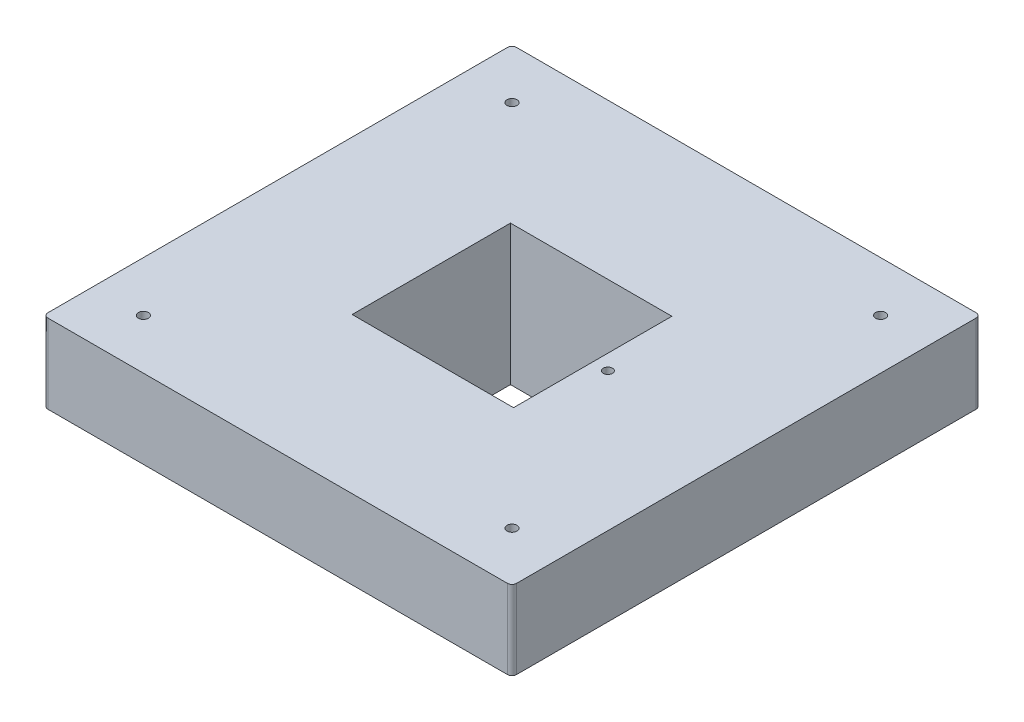
ISO-10303-21;
HEADER;
FILE_DESCRIPTION(('STEP AP214'),'2;1');
FILE_NAME('part.step','',(''),(''),'','','');
FILE_SCHEMA(('AUTOMOTIVE_DESIGN { 1 0 10303 214 1 1 1 1 }'));
ENDSEC;
DATA;
#1=APPLICATION_CONTEXT('core data for automotive mechanical design processes');
#2=APPLICATION_PROTOCOL_DEFINITION('international standard','automotive_design',2000,#1);
#3=PRODUCT_CONTEXT('',#1,'mechanical');
#4=PRODUCT('Part','Part','',(#3));
#5=PRODUCT_RELATED_PRODUCT_CATEGORY('part','',(#4));
#6=PRODUCT_DEFINITION_FORMATION('','',#4);
#7=PRODUCT_DEFINITION_CONTEXT('part definition',#1,'design');
#8=PRODUCT_DEFINITION('design','',#6,#7);
#9=PRODUCT_DEFINITION_SHAPE('','',#8);
#10=(LENGTH_UNIT() NAMED_UNIT(*) SI_UNIT(.MILLI.,.METRE.));
#11=(NAMED_UNIT(*) PLANE_ANGLE_UNIT() SI_UNIT($,.RADIAN.));
#12=(NAMED_UNIT(*) SI_UNIT($,.STERADIAN.) SOLID_ANGLE_UNIT());
#13=UNCERTAINTY_MEASURE_WITH_UNIT(LENGTH_MEASURE(1.E-05),#10,'distance_accuracy_value','');
#14=(GEOMETRIC_REPRESENTATION_CONTEXT(3) GLOBAL_UNCERTAINTY_ASSIGNED_CONTEXT((#13)) GLOBAL_UNIT_ASSIGNED_CONTEXT((#10,
#11,#12)) REPRESENTATION_CONTEXT('',''));
#15=CARTESIAN_POINT('',(0.,0.,0.));
#16=DIRECTION('',(0.,0.,1.));
#17=DIRECTION('',(1.,0.,0.));
#18=AXIS2_PLACEMENT_3D('',#15,#16,#17);
#19=CARTESIAN_POINT('',(0.,-25.95,0.));
#20=DIRECTION('',(0.,1.,0.));
#21=DIRECTION('',(0.,0.,1.));
#22=AXIS2_PLACEMENT_3D('',#19,#20,#21);
#23=PLANE('',#22);
#24=DIRECTION('',(0.,0.,-1.));
#25=VECTOR('',#24,1.);
#26=CARTESIAN_POINT('',(-76.96,-25.95,0.));
#27=LINE('',#26,#25);
#28=CARTESIAN_POINT('',(-76.96,-25.95,75.46));
#29=VERTEX_POINT('',#28);
#30=CARTESIAN_POINT('',(-76.96,-25.95,-75.46));
#31=VERTEX_POINT('',#30);
#32=EDGE_CURVE('E195',#29,#31,#27,.T.);
#33=ORIENTED_EDGE('',*,*,#32,.T.);
#34=CARTESIAN_POINT('',(-75.46,-25.95,-75.46));
#35=DIRECTION('',(0.,1.,0.));
#36=DIRECTION('',(0.,0.,1.));
#37=AXIS2_PLACEMENT_3D('',#34,#35,#36);
#38=CIRCLE('',#37,1.5);
#39=CARTESIAN_POINT('',(-75.46,-25.95,-76.96));
#40=VERTEX_POINT('',#39);
#41=EDGE_CURVE('E250',#31,#40,#38,.F.);
#42=ORIENTED_EDGE('',*,*,#41,.T.);
#43=DIRECTION('',(1.,0.,0.));
#44=VECTOR('',#43,1.);
#45=CARTESIAN_POINT('',(0.,-25.95,-76.96));
#46=LINE('',#45,#44);
#47=CARTESIAN_POINT('',(75.46,-25.95,-76.96));
#48=VERTEX_POINT('',#47);
#49=EDGE_CURVE('E193',#40,#48,#46,.T.);
#50=ORIENTED_EDGE('',*,*,#49,.T.);
#51=CARTESIAN_POINT('',(75.46,-25.95,-75.46));
#52=DIRECTION('',(0.,1.,0.));
#53=DIRECTION('',(0.,0.,1.));
#54=AXIS2_PLACEMENT_3D('',#51,#52,#53);
#55=CIRCLE('',#54,1.5);
#56=CARTESIAN_POINT('',(76.96,-25.95,-75.46));
#57=VERTEX_POINT('',#56);
#58=EDGE_CURVE('E49',#48,#57,#55,.F.);
#59=ORIENTED_EDGE('',*,*,#58,.T.);
#60=DIRECTION('',(0.,0.,-1.));
#61=VECTOR('',#60,1.);
#62=CARTESIAN_POINT('',(76.96,-25.95,0.));
#63=LINE('',#62,#61);
#64=CARTESIAN_POINT('',(76.96,-25.95,75.46));
#65=VERTEX_POINT('',#64);
#66=EDGE_CURVE('E191',#65,#57,#63,.T.);
#67=ORIENTED_EDGE('',*,*,#66,.F.);
#68=CARTESIAN_POINT('',(75.46,-25.95,75.46));
#69=DIRECTION('',(0.,1.,0.));
#70=DIRECTION('',(0.,0.,1.));
#71=AXIS2_PLACEMENT_3D('',#68,#69,#70);
#72=CIRCLE('',#71,1.5);
#73=CARTESIAN_POINT('',(75.46,-25.95,76.96));
#74=VERTEX_POINT('',#73);
#75=EDGE_CURVE('E245',#65,#74,#72,.F.);
#76=ORIENTED_EDGE('',*,*,#75,.T.);
#77=DIRECTION('',(1.,0.,0.));
#78=VECTOR('',#77,1.);
#79=CARTESIAN_POINT('',(0.,-25.95,76.96));
#80=LINE('',#79,#78);
#81=CARTESIAN_POINT('',(-75.46,-25.95,76.96));
#82=VERTEX_POINT('',#81);
#83=EDGE_CURVE('E187',#82,#74,#80,.T.);
#84=ORIENTED_EDGE('',*,*,#83,.F.);
#85=CARTESIAN_POINT('',(-75.46,-25.95,75.46));
#86=DIRECTION('',(0.,1.,0.));
#87=DIRECTION('',(0.,0.,1.));
#88=AXIS2_PLACEMENT_3D('',#85,#86,#87);
#89=CIRCLE('',#88,1.5);
#90=EDGE_CURVE('E247',#82,#29,#89,.F.);
#91=ORIENTED_EDGE('',*,*,#90,.T.);
#92=EDGE_LOOP('',(#33,#42,#50,#59,#67,#76,#84,#91));
#93=FACE_BOUND('',#92,.T.);
#94=CARTESIAN_POINT('',(60.5282,-25.95,-60.5282));
#95=DIRECTION('',(0.,1.,0.));
#96=DIRECTION('',(0.,0.,1.));
#97=AXIS2_PLACEMENT_3D('',#94,#95,#96);
#98=CIRCLE('',#97,1.64999999999998);
#99=CARTESIAN_POINT('',(60.5282,-25.95,-58.8782));
#100=VERTEX_POINT('',#99);
#101=EDGE_CURVE('E180',#100,#100,#98,.T.);
#102=ORIENTED_EDGE('',*,*,#101,.T.);
#103=EDGE_LOOP('',(#102));
#104=FACE_BOUND('',#103,.T.);
#105=CARTESIAN_POINT('',(60.5282,-25.95,60.5282));
#106=DIRECTION('',(0.,1.,0.));
#107=DIRECTION('',(0.,0.,1.));
#108=AXIS2_PLACEMENT_3D('',#105,#106,#107);
#109=CIRCLE('',#108,1.64999999999998);
#110=CARTESIAN_POINT('',(60.5282,-25.95,62.1782));
#111=VERTEX_POINT('',#110);
#112=EDGE_CURVE('E174',#111,#111,#109,.T.);
#113=ORIENTED_EDGE('',*,*,#112,.T.);
#114=EDGE_LOOP('',(#113));
#115=FACE_BOUND('',#114,.T.);
#116=CARTESIAN_POINT('',(-60.5282,-25.95,60.5282));
#117=DIRECTION('',(0.,1.,0.));
#118=DIRECTION('',(0.,0.,1.));
#119=AXIS2_PLACEMENT_3D('',#116,#117,#118);
#120=CIRCLE('',#119,1.64999999999998);
#121=CARTESIAN_POINT('',(-60.5282,-25.95,62.1782));
#122=VERTEX_POINT('',#121);
#123=EDGE_CURVE('E168',#122,#122,#120,.T.);
#124=ORIENTED_EDGE('',*,*,#123,.T.);
#125=EDGE_LOOP('',(#124));
#126=FACE_BOUND('',#125,.T.);
#127=CARTESIAN_POINT('',(-60.5282,-25.95,-60.5282));
#128=DIRECTION('',(0.,1.,0.));
#129=DIRECTION('',(0.,0.,1.));
#130=AXIS2_PLACEMENT_3D('',#127,#128,#129);
#131=CIRCLE('',#130,1.64999999999998);
#132=CARTESIAN_POINT('',(-60.5282,-25.95,-58.8782));
#133=VERTEX_POINT('',#132);
#134=EDGE_CURVE('E162',#133,#133,#131,.T.);
#135=ORIENTED_EDGE('',*,*,#134,.T.);
#136=EDGE_LOOP('',(#135));
#137=FACE_BOUND('',#136,.T.);
#138=CARTESIAN_POINT('',(0.,-25.95,0.));
#139=DIRECTION('',(0.,1.,0.));
#140=DIRECTION('',(0.,0.,1.));
#141=AXIS2_PLACEMENT_3D('',#138,#139,#140);
#142=CIRCLE('',#141,55.);
#143=CARTESIAN_POINT('',(0.,-25.95,55.));
#144=VERTEX_POINT('',#143);
#145=EDGE_CURVE('E135',#144,#144,#142,.F.);
#146=ORIENTED_EDGE('',*,*,#145,.F.);
#147=EDGE_LOOP('',(#146));
#148=FACE_BOUND('',#147,.T.);
#149=ADVANCED_FACE('F34',(#93,#104,#115,#126,#137,#148),#23,.F.);
#150=CARTESIAN_POINT('',(0.,-25.95,76.96));
#151=DIRECTION('',(0.,0.,1.));
#152=DIRECTION('',(1.,0.,0.));
#153=AXIS2_PLACEMENT_3D('',#150,#151,#152);
#154=PLANE('',#153);
#155=DIRECTION('',(1.,0.,0.));
#156=VECTOR('',#155,1.);
#157=CARTESIAN_POINT('',(0.,0.,76.96));
#158=LINE('',#157,#156);
#159=CARTESIAN_POINT('',(-75.46,0.,76.96));
#160=VERTEX_POINT('',#159);
#161=CARTESIAN_POINT('',(75.46,0.,76.96));
#162=VERTEX_POINT('',#161);
#163=EDGE_CURVE('E210',#160,#162,#158,.T.);
#164=ORIENTED_EDGE('',*,*,#163,.F.);
#165=DIRECTION('',(0.,1.,0.));
#166=VECTOR('',#165,1.);
#167=CARTESIAN_POINT('',(-75.46,-25.95,76.96));
#168=LINE('',#167,#166);
#169=EDGE_CURVE('E11',#160,#82,#168,.F.);
#170=ORIENTED_EDGE('',*,*,#169,.T.);
#171=ORIENTED_EDGE('',*,*,#83,.T.);
#172=DIRECTION('',(0.,1.,0.));
#173=VECTOR('',#172,1.);
#174=CARTESIAN_POINT('',(75.46,-25.95,76.96));
#175=LINE('',#174,#173);
#176=EDGE_CURVE('E42',#74,#162,#175,.T.);
#177=ORIENTED_EDGE('',*,*,#176,.T.);
#178=EDGE_LOOP('',(#164,#170,#171,#177));
#179=FACE_BOUND('',#178,.T.);
#180=ADVANCED_FACE('F259',(#179),#154,.T.);
#181=CARTESIAN_POINT('',(-76.96,-25.95,0.));
#182=DIRECTION('',(1.,0.,0.));
#183=DIRECTION('',(0.,0.,-1.));
#184=AXIS2_PLACEMENT_3D('',#181,#182,#183);
#185=PLANE('',#184);
#186=DIRECTION('',(0.,0.,-1.));
#187=VECTOR('',#186,1.);
#188=CARTESIAN_POINT('',(-76.96,0.,0.));
#189=LINE('',#188,#187);
#190=CARTESIAN_POINT('',(-76.96,0.,75.46));
#191=VERTEX_POINT('',#190);
#192=CARTESIAN_POINT('',(-76.96,0.,-75.46));
#193=VERTEX_POINT('',#192);
#194=EDGE_CURVE('E188',#191,#193,#189,.T.);
#195=ORIENTED_EDGE('',*,*,#194,.T.);
#196=DIRECTION('',(0.,1.,0.));
#197=VECTOR('',#196,1.);
#198=CARTESIAN_POINT('',(-76.96,-25.95,-75.46));
#199=LINE('',#198,#197);
#200=EDGE_CURVE('E243',#193,#31,#199,.F.);
#201=ORIENTED_EDGE('',*,*,#200,.T.);
#202=ORIENTED_EDGE('',*,*,#32,.F.);
#203=DIRECTION('',(0.,1.,0.));
#204=VECTOR('',#203,1.);
#205=CARTESIAN_POINT('',(-76.96,0.,75.46));
#206=LINE('',#205,#204);
#207=EDGE_CURVE('E240',#29,#191,#206,.T.);
#208=ORIENTED_EDGE('',*,*,#207,.T.);
#209=EDGE_LOOP('',(#195,#201,#202,#208));
#210=FACE_BOUND('',#209,.T.);
#211=ADVANCED_FACE('F274',(#210),#185,.F.);
#212=CARTESIAN_POINT('',(0.,-25.95,-76.96));
#213=DIRECTION('',(0.,0.,1.));
#214=DIRECTION('',(1.,0.,0.));
#215=AXIS2_PLACEMENT_3D('',#212,#213,#214);
#216=PLANE('',#215);
#217=ORIENTED_EDGE('',*,*,#49,.F.);
#218=DIRECTION('',(0.,1.,0.));
#219=VECTOR('',#218,1.);
#220=CARTESIAN_POINT('',(-75.46,-25.95,-76.96));
#221=LINE('',#220,#219);
#222=CARTESIAN_POINT('',(-75.46,0.,-76.96));
#223=VERTEX_POINT('',#222);
#224=EDGE_CURVE('E229',#40,#223,#221,.T.);
#225=ORIENTED_EDGE('',*,*,#224,.T.);
#226=DIRECTION('',(1.,0.,0.));
#227=VECTOR('',#226,1.);
#228=CARTESIAN_POINT('',(0.,0.,-76.96));
#229=LINE('',#228,#227);
#230=CARTESIAN_POINT('',(75.46,0.,-76.96));
#231=VERTEX_POINT('',#230);
#232=EDGE_CURVE('E216',#223,#231,#229,.T.);
#233=ORIENTED_EDGE('',*,*,#232,.T.);
#234=DIRECTION('',(0.,1.,0.));
#235=VECTOR('',#234,1.);
#236=CARTESIAN_POINT('',(75.46,-25.95,-76.96));
#237=LINE('',#236,#235);
#238=EDGE_CURVE('E227',#231,#48,#237,.F.);
#239=ORIENTED_EDGE('',*,*,#238,.T.);
#240=EDGE_LOOP('',(#217,#225,#233,#239));
#241=FACE_BOUND('',#240,.T.);
#242=ADVANCED_FACE('F283',(#241),#216,.F.);
#243=CARTESIAN_POINT('',(0.,-25.95,-26.));
#244=DIRECTION('',(0.,0.,1.));
#245=DIRECTION('',(1.,0.,0.));
#246=AXIS2_PLACEMENT_3D('',#243,#244,#245);
#247=PLANE('',#246);
#248=DIRECTION('',(1.,0.,0.));
#249=VECTOR('',#248,1.);
#250=CARTESIAN_POINT('',(0.,0.,-26.));
#251=LINE('',#250,#249);
#252=CARTESIAN_POINT('',(-26.5,0.,-26.));
#253=VERTEX_POINT('',#252);
#254=CARTESIAN_POINT('',(26.5,0.,-26.));
#255=VERTEX_POINT('',#254);
#256=EDGE_CURVE('E131',#253,#255,#251,.T.);
#257=ORIENTED_EDGE('',*,*,#256,.F.);
#258=DIRECTION('',(0.,1.,0.));
#259=VECTOR('',#258,1.);
#260=CARTESIAN_POINT('',(-26.5,-25.95,-26.));
#261=LINE('',#260,#259);
#262=CARTESIAN_POINT('',(-26.5,-45.95,-26.));
#263=VERTEX_POINT('',#262);
#264=EDGE_CURVE('E124',#263,#253,#261,.T.);
#265=ORIENTED_EDGE('',*,*,#264,.F.);
#266=DIRECTION('',(1.,0.,0.));
#267=VECTOR('',#266,1.);
#268=CARTESIAN_POINT('',(-26.5,-45.95,-26.));
#269=LINE('',#268,#267);
#270=CARTESIAN_POINT('',(26.5,-45.95,-26.));
#271=VERTEX_POINT('',#270);
#272=EDGE_CURVE('E128',#263,#271,#269,.T.);
#273=ORIENTED_EDGE('',*,*,#272,.T.);
#274=DIRECTION('',(0.,1.,0.));
#275=VECTOR('',#274,1.);
#276=CARTESIAN_POINT('',(26.5,-25.95,-26.));
#277=LINE('',#276,#275);
#278=EDGE_CURVE('E198',#271,#255,#277,.T.);
#279=ORIENTED_EDGE('',*,*,#278,.T.);
#280=EDGE_LOOP('',(#257,#265,#273,#279));
#281=FACE_BOUND('',#280,.T.);
#282=ADVANCED_FACE('F126',(#281),#247,.T.);
#283=CARTESIAN_POINT('',(-26.5,-25.95,0.));
#284=DIRECTION('',(-1.,0.,0.));
#285=DIRECTION('',(0.,0.,1.));
#286=AXIS2_PLACEMENT_3D('',#283,#284,#285);
#287=PLANE('',#286);
#288=DIRECTION('',(0.,0.,1.));
#289=VECTOR('',#288,1.);
#290=CARTESIAN_POINT('',(-26.5,0.,0.));
#291=LINE('',#290,#289);
#292=CARTESIAN_POINT('',(-26.5,0.,26.));
#293=VERTEX_POINT('',#292);
#294=EDGE_CURVE('E208',#253,#293,#291,.T.);
#295=ORIENTED_EDGE('',*,*,#294,.T.);
#296=DIRECTION('',(0.,1.,0.));
#297=VECTOR('',#296,1.);
#298=CARTESIAN_POINT('',(-26.5,-25.95,26.));
#299=LINE('',#298,#297);
#300=CARTESIAN_POINT('',(-26.5,-45.95,26.));
#301=VERTEX_POINT('',#300);
#302=EDGE_CURVE('E136',#301,#293,#299,.T.);
#303=ORIENTED_EDGE('',*,*,#302,.F.);
#304=DIRECTION('',(0.,0.,-1.));
#305=VECTOR('',#304,1.);
#306=CARTESIAN_POINT('',(-26.5,-45.95,26.));
#307=LINE('',#306,#305);
#308=EDGE_CURVE('E139',#301,#263,#307,.T.);
#309=ORIENTED_EDGE('',*,*,#308,.T.);
#310=ORIENTED_EDGE('',*,*,#264,.T.);
#311=EDGE_LOOP('',(#295,#303,#309,#310));
#312=FACE_BOUND('',#311,.T.);
#313=ADVANCED_FACE('F140',(#312),#287,.F.);
#314=CARTESIAN_POINT('',(0.,-25.95,26.));
#315=DIRECTION('',(0.,0.,1.));
#316=DIRECTION('',(1.,0.,0.));
#317=AXIS2_PLACEMENT_3D('',#314,#315,#316);
#318=PLANE('',#317);
#319=DIRECTION('',(1.,0.,0.));
#320=VECTOR('',#319,1.);
#321=CARTESIAN_POINT('',(0.,0.,26.));
#322=LINE('',#321,#320);
#323=CARTESIAN_POINT('',(26.5,0.,26.));
#324=VERTEX_POINT('',#323);
#325=EDGE_CURVE('E205',#293,#324,#322,.T.);
#326=ORIENTED_EDGE('',*,*,#325,.T.);
#327=DIRECTION('',(0.,1.,0.));
#328=VECTOR('',#327,1.);
#329=CARTESIAN_POINT('',(26.5,-25.95,26.));
#330=LINE('',#329,#328);
#331=CARTESIAN_POINT('',(26.5,-45.95,26.));
#332=VERTEX_POINT('',#331);
#333=EDGE_CURVE('E222',#332,#324,#330,.T.);
#334=ORIENTED_EDGE('',*,*,#333,.F.);
#335=DIRECTION('',(-1.,0.,0.));
#336=VECTOR('',#335,1.);
#337=CARTESIAN_POINT('',(-26.5,-45.95,26.));
#338=LINE('',#337,#336);
#339=EDGE_CURVE('E151',#332,#301,#338,.T.);
#340=ORIENTED_EDGE('',*,*,#339,.T.);
#341=ORIENTED_EDGE('',*,*,#302,.T.);
#342=EDGE_LOOP('',(#326,#334,#340,#341));
#343=FACE_BOUND('',#342,.T.);
#344=ADVANCED_FACE('F315',(#343),#318,.F.);
#345=CARTESIAN_POINT('',(26.5,-25.95,0.));
#346=DIRECTION('',(-1.,0.,0.));
#347=DIRECTION('',(0.,0.,1.));
#348=AXIS2_PLACEMENT_3D('',#345,#346,#347);
#349=PLANE('',#348);
#350=DIRECTION('',(0.,0.,1.));
#351=VECTOR('',#350,1.);
#352=CARTESIAN_POINT('',(26.5,0.,0.));
#353=LINE('',#352,#351);
#354=EDGE_CURVE('E202',#255,#324,#353,.T.);
#355=ORIENTED_EDGE('',*,*,#354,.F.);
#356=ORIENTED_EDGE('',*,*,#278,.F.);
#357=DIRECTION('',(0.,0.,1.));
#358=VECTOR('',#357,1.);
#359=CARTESIAN_POINT('',(26.5,-45.95,26.));
#360=LINE('',#359,#358);
#361=EDGE_CURVE('E149',#271,#332,#360,.T.);
#362=ORIENTED_EDGE('',*,*,#361,.T.);
#363=ORIENTED_EDGE('',*,*,#333,.T.);
#364=EDGE_LOOP('',(#355,#356,#362,#363));
#365=FACE_BOUND('',#364,.T.);
#366=ADVANCED_FACE('F318',(#365),#349,.T.);
#367=CARTESIAN_POINT('',(31.5,-25.95,0.));
#368=DIRECTION('',(0.,1.,0.));
#369=DIRECTION('',(0.,0.,1.));
#370=AXIS2_PLACEMENT_3D('',#367,#368,#369);
#371=CYLINDRICAL_SURFACE('',#370,1.5);
#372=CARTESIAN_POINT('',(31.5,-25.95,0.));
#373=DIRECTION('',(0.,1.,0.));
#374=DIRECTION('',(0.,0.,1.));
#375=AXIS2_PLACEMENT_3D('',#372,#373,#374);
#376=CIRCLE('',#375,1.5);
#377=CARTESIAN_POINT('',(31.5,-25.95,1.5));
#378=VERTEX_POINT('',#377);
#379=EDGE_CURVE('E184',#378,#378,#376,.T.);
#380=CARTESIAN_POINT('',(31.5,0.,0.));
#381=DIRECTION('',(0.,1.,0.));
#382=DIRECTION('',(0.,0.,1.));
#383=AXIS2_PLACEMENT_3D('',#380,#381,#382);
#384=CIRCLE('',#383,1.5);
#385=CARTESIAN_POINT('',(31.5,0.,1.5));
#386=VERTEX_POINT('',#385);
#387=EDGE_CURVE('E183',#386,#386,#384,.T.);
#388=CARTESIAN_POINT('',(31.5,-25.95,1.5));
#389=CARTESIAN_POINT('',(31.5,-25.6796875,1.5));
#390=CARTESIAN_POINT('',(31.5,-25.409375,1.5));
#391=CARTESIAN_POINT('',(31.5,-24.86875,1.5));
#392=CARTESIAN_POINT('',(31.5,-24.5984375,1.5));
#393=CARTESIAN_POINT('',(31.5,-24.0578125,1.5));
#394=CARTESIAN_POINT('',(31.5,-23.7875,1.5));
#395=CARTESIAN_POINT('',(31.5,-23.246875,1.5));
#396=CARTESIAN_POINT('',(31.5,-22.9765625,1.5));
#397=CARTESIAN_POINT('',(31.5,-22.4359375,1.5));
#398=CARTESIAN_POINT('',(31.5,-22.165625,1.5));
#399=CARTESIAN_POINT('',(31.5,-21.625,1.5));
#400=CARTESIAN_POINT('',(31.5,-21.3546875,1.5));
#401=CARTESIAN_POINT('',(31.5,-20.8140625,1.5));
#402=CARTESIAN_POINT('',(31.5,-20.54375,1.5));
#403=CARTESIAN_POINT('',(31.5,-20.003125,1.5));
#404=CARTESIAN_POINT('',(31.5,-19.7328125,1.5));
#405=CARTESIAN_POINT('',(31.5,-19.1921875,1.5));
#406=CARTESIAN_POINT('',(31.5,-18.921875,1.5));
#407=CARTESIAN_POINT('',(31.5,-18.38125,1.5));
#408=CARTESIAN_POINT('',(31.5,-18.1109375,1.5));
#409=CARTESIAN_POINT('',(31.5,-17.5703125,1.5));
#410=CARTESIAN_POINT('',(31.5,-17.3,1.5));
#411=CARTESIAN_POINT('',(31.5,-16.759375,1.5));
#412=CARTESIAN_POINT('',(31.5,-16.4890625,1.5));
#413=CARTESIAN_POINT('',(31.5,-15.9484375,1.5));
#414=CARTESIAN_POINT('',(31.5,-15.678125,1.5));
#415=CARTESIAN_POINT('',(31.5,-15.1375,1.5));
#416=CARTESIAN_POINT('',(31.5,-14.8671875,1.5));
#417=CARTESIAN_POINT('',(31.5,-14.3265625,1.5));
#418=CARTESIAN_POINT('',(31.5,-14.05625,1.5));
#419=CARTESIAN_POINT('',(31.5,-13.515625,1.5));
#420=CARTESIAN_POINT('',(31.5,-13.2453125,1.5));
#421=CARTESIAN_POINT('',(31.5,-12.7046875,1.5));
#422=CARTESIAN_POINT('',(31.5,-12.434375,1.5));
#423=CARTESIAN_POINT('',(31.5,-11.89375,1.5));
#424=CARTESIAN_POINT('',(31.5,-11.6234375,1.5));
#425=CARTESIAN_POINT('',(31.5,-11.0828125,1.5));
#426=CARTESIAN_POINT('',(31.5,-10.8125,1.5));
#427=CARTESIAN_POINT('',(31.5,-10.271875,1.5));
#428=CARTESIAN_POINT('',(31.5,-10.0015625,1.5));
#429=CARTESIAN_POINT('',(31.5,-9.4609375,1.5));
#430=CARTESIAN_POINT('',(31.5,-9.190625,1.5));
#431=CARTESIAN_POINT('',(31.5,-8.65,1.5));
#432=CARTESIAN_POINT('',(31.5,-8.3796875,1.5));
#433=CARTESIAN_POINT('',(31.5,-7.83906250000001,1.5));
#434=CARTESIAN_POINT('',(31.5,-7.56875,1.5));
#435=CARTESIAN_POINT('',(31.5,-7.028125,1.5));
#436=CARTESIAN_POINT('',(31.5,-6.7578125,1.5));
#437=CARTESIAN_POINT('',(31.5,-6.2171875,1.5));
#438=CARTESIAN_POINT('',(31.5,-5.946875,1.5));
#439=CARTESIAN_POINT('',(31.5,-5.40625,1.5));
#440=CARTESIAN_POINT('',(31.5,-5.1359375,1.5));
#441=CARTESIAN_POINT('',(31.5,-4.5953125,1.5));
#442=CARTESIAN_POINT('',(31.5,-4.325,1.5));
#443=CARTESIAN_POINT('',(31.5,-3.784375,1.5));
#444=CARTESIAN_POINT('',(31.5,-3.5140625,1.5));
#445=CARTESIAN_POINT('',(31.5,-2.9734375,1.5));
#446=CARTESIAN_POINT('',(31.5,-2.703125,1.5));
#447=CARTESIAN_POINT('',(31.5,-2.1625,1.5));
#448=CARTESIAN_POINT('',(31.5,-1.8921875,1.5));
#449=CARTESIAN_POINT('',(31.5,-1.3515625,1.5));
#450=CARTESIAN_POINT('',(31.5,-1.08125,1.5));
#451=CARTESIAN_POINT('',(31.5,-0.540625000000004,1.5));
#452=CARTESIAN_POINT('',(31.5,-0.270312500000004,1.5));
#453=CARTESIAN_POINT('',(31.5,0.,1.5));
#454=B_SPLINE_CURVE_WITH_KNOTS('',3,(#388,#389,#390,#391,#392,#393,#394,#395,#396,#397,#398,
#399,#400,#401,#402,#403,#404,#405,#406,#407,#408,#409,#410,#411,#412,#413,#414,#415,#416,#417,
#418,#419,#420,#421,#422,#423,#424,#425,#426,#427,#428,#429,#430,#431,#432,#433,#434,#435,#436,
#437,#438,#439,#440,#441,#442,#443,#444,#445,#446,#447,#448,#449,#450,#451,#452,#453),
.UNSPECIFIED.,.F.,.F.,(4,2,2,2,2,2,2,2,2,2,2,2,2,2,2,2,2,2,2,2,2,2,2,2,2,2,2,2,2,2,2,2,4),(0.,
0.810937499999997,1.621875,2.4328125,3.24375,4.0546875,4.865625,5.6765625,6.4875,7.2984375,
8.10937499999999,8.9203125,9.73125,10.5421875,11.353125,12.1640625,12.975,13.7859375,14.596875,
15.4078125,16.21875,17.0296875,17.840625,18.6515625,19.4625,20.2734375,21.084375,21.8953125,
22.70625,23.5171875,24.328125,25.1390625,25.95),.UNSPECIFIED.);
#455=EDGE_CURVE('BSEAM311',#378,#386,#454,.T.);
#456=ORIENTED_EDGE('',*,*,#379,.F.);
#457=ORIENTED_EDGE('',*,*,#387,.T.);
#458=ORIENTED_EDGE('',*,*,#455,.T.);
#459=ORIENTED_EDGE('',*,*,#455,.F.);
#460=EDGE_LOOP('',(#456,#458,#457,#459));
#461=FACE_BOUND('',#460,.T.);
#462=ADVANCED_FACE('F311',(#461),#371,.F.);
#463=CARTESIAN_POINT('',(76.96,-25.95,0.));
#464=DIRECTION('',(1.,0.,0.));
#465=DIRECTION('',(0.,0.,-1.));
#466=AXIS2_PLACEMENT_3D('',#463,#464,#465);
#467=PLANE('',#466);
#468=ORIENTED_EDGE('',*,*,#66,.T.);
#469=DIRECTION('',(0.,1.,0.));
#470=VECTOR('',#469,1.);
#471=CARTESIAN_POINT('',(76.96,0.,-75.46));
#472=LINE('',#471,#470);
#473=CARTESIAN_POINT('',(76.96,0.,-75.46));
#474=VERTEX_POINT('',#473);
#475=EDGE_CURVE('E253',#57,#474,#472,.T.);
#476=ORIENTED_EDGE('',*,*,#475,.T.);
#477=DIRECTION('',(0.,0.,-1.));
#478=VECTOR('',#477,1.);
#479=CARTESIAN_POINT('',(76.96,0.,0.));
#480=LINE('',#479,#478);
#481=CARTESIAN_POINT('',(76.96,0.,75.46));
#482=VERTEX_POINT('',#481);
#483=EDGE_CURVE('E213',#482,#474,#480,.T.);
#484=ORIENTED_EDGE('',*,*,#483,.F.);
#485=DIRECTION('',(0.,1.,0.));
#486=VECTOR('',#485,1.);
#487=CARTESIAN_POINT('',(76.96,-25.95,75.46));
#488=LINE('',#487,#486);
#489=EDGE_CURVE('E56',#482,#65,#488,.F.);
#490=ORIENTED_EDGE('',*,*,#489,.T.);
#491=EDGE_LOOP('',(#468,#476,#484,#490));
#492=FACE_BOUND('',#491,.T.);
#493=ADVANCED_FACE('F288',(#492),#467,.T.);
#494=CARTESIAN_POINT('',(0.,0.,0.));
#495=DIRECTION('',(0.,1.,0.));
#496=DIRECTION('',(0.,0.,1.));
#497=AXIS2_PLACEMENT_3D('',#494,#495,#496);
#498=PLANE('',#497);
#499=CARTESIAN_POINT('',(-60.5282,0.,-60.5282));
#500=DIRECTION('',(0.,1.,0.));
#501=DIRECTION('',(0.,0.,1.));
#502=AXIS2_PLACEMENT_3D('',#499,#500,#501);
#503=CIRCLE('',#502,1.64999999999999);
#504=CARTESIAN_POINT('',(-60.5282,0.,-58.8782));
#505=VERTEX_POINT('',#504);
#506=EDGE_CURVE('E159',#505,#505,#503,.T.);
#507=ORIENTED_EDGE('',*,*,#506,.F.);
#508=EDGE_LOOP('',(#507));
#509=FACE_BOUND('',#508,.T.);
#510=CARTESIAN_POINT('',(-60.5282,0.,60.5282));
#511=DIRECTION('',(0.,1.,0.));
#512=DIRECTION('',(0.,0.,1.));
#513=AXIS2_PLACEMENT_3D('',#510,#511,#512);
#514=CIRCLE('',#513,1.64999999999998);
#515=CARTESIAN_POINT('',(-60.5282,0.,62.1782));
#516=VERTEX_POINT('',#515);
#517=EDGE_CURVE('E165',#516,#516,#514,.T.);
#518=ORIENTED_EDGE('',*,*,#517,.F.);
#519=EDGE_LOOP('',(#518));
#520=FACE_BOUND('',#519,.T.);
#521=CARTESIAN_POINT('',(60.5282,0.,60.5282));
#522=DIRECTION('',(0.,1.,0.));
#523=DIRECTION('',(0.,0.,1.));
#524=AXIS2_PLACEMENT_3D('',#521,#522,#523);
#525=CIRCLE('',#524,1.64999999999998);
#526=CARTESIAN_POINT('',(60.5282,0.,62.1782));
#527=VERTEX_POINT('',#526);
#528=EDGE_CURVE('E171',#527,#527,#525,.T.);
#529=ORIENTED_EDGE('',*,*,#528,.F.);
#530=EDGE_LOOP('',(#529));
#531=FACE_BOUND('',#530,.T.);
#532=CARTESIAN_POINT('',(60.5282,0.,-60.5282));
#533=DIRECTION('',(0.,1.,0.));
#534=DIRECTION('',(0.,0.,1.));
#535=AXIS2_PLACEMENT_3D('',#532,#533,#534);
#536=CIRCLE('',#535,1.64999999999999);
#537=CARTESIAN_POINT('',(60.5282,0.,-58.8782));
#538=VERTEX_POINT('',#537);
#539=EDGE_CURVE('E177',#538,#538,#536,.T.);
#540=ORIENTED_EDGE('',*,*,#539,.F.);
#541=EDGE_LOOP('',(#540));
#542=FACE_BOUND('',#541,.T.);
#543=ORIENTED_EDGE('',*,*,#387,.F.);
#544=EDGE_LOOP('',(#543));
#545=FACE_BOUND('',#544,.T.);
#546=ORIENTED_EDGE('',*,*,#256,.T.);
#547=ORIENTED_EDGE('',*,*,#354,.T.);
#548=ORIENTED_EDGE('',*,*,#325,.F.);
#549=ORIENTED_EDGE('',*,*,#294,.F.);
#550=EDGE_LOOP('',(#546,#547,#548,#549));
#551=FACE_BOUND('',#550,.T.);
#552=ORIENTED_EDGE('',*,*,#232,.F.);
#553=CARTESIAN_POINT('',(-75.46,0.,-75.46));
#554=DIRECTION('',(0.,1.,0.));
#555=DIRECTION('',(0.,0.,1.));
#556=AXIS2_PLACEMENT_3D('',#553,#554,#555);
#557=CIRCLE('',#556,1.5);
#558=EDGE_CURVE('E238',#223,#193,#557,.T.);
#559=ORIENTED_EDGE('',*,*,#558,.T.);
#560=ORIENTED_EDGE('',*,*,#194,.F.);
#561=CARTESIAN_POINT('',(-75.46,0.,75.46));
#562=DIRECTION('',(0.,1.,0.));
#563=DIRECTION('',(0.,0.,1.));
#564=AXIS2_PLACEMENT_3D('',#561,#562,#563);
#565=CIRCLE('',#564,1.5);
#566=EDGE_CURVE('E234',#191,#160,#565,.T.);
#567=ORIENTED_EDGE('',*,*,#566,.T.);
#568=ORIENTED_EDGE('',*,*,#163,.T.);
#569=CARTESIAN_POINT('',(75.46,0.,75.46));
#570=DIRECTION('',(0.,1.,0.));
#571=DIRECTION('',(0.,0.,1.));
#572=AXIS2_PLACEMENT_3D('',#569,#570,#571);
#573=CIRCLE('',#572,1.5);
#574=EDGE_CURVE('E232',#162,#482,#573,.T.);
#575=ORIENTED_EDGE('',*,*,#574,.T.);
#576=ORIENTED_EDGE('',*,*,#483,.T.);
#577=CARTESIAN_POINT('',(75.46,0.,-75.46));
#578=DIRECTION('',(0.,1.,0.));
#579=DIRECTION('',(0.,0.,1.));
#580=AXIS2_PLACEMENT_3D('',#577,#578,#579);
#581=CIRCLE('',#580,1.5);
#582=EDGE_CURVE('E236',#474,#231,#581,.T.);
#583=ORIENTED_EDGE('',*,*,#582,.T.);
#584=EDGE_LOOP('',(#552,#559,#560,#567,#568,#575,#576,#583));
#585=FACE_BOUND('',#584,.T.);
#586=ADVANCED_FACE('F266',(#509,#520,#531,#542,#545,#551,#585),#498,.T.);
#587=CARTESIAN_POINT('',(60.5282,0.,-60.5282));
#588=DIRECTION('',(0.,1.,0.));
#589=DIRECTION('',(0.,0.,1.));
#590=AXIS2_PLACEMENT_3D('',#587,#588,#589);
#591=CYLINDRICAL_SURFACE('',#590,1.64999999999999);
#592=ORIENTED_EDGE('',*,*,#101,.F.);
#593=EDGE_LOOP('',(#592));
#594=FACE_BOUND('',#593,.T.);
#595=ORIENTED_EDGE('',*,*,#539,.T.);
#596=EDGE_LOOP('',(#595));
#597=FACE_BOUND('',#596,.T.);
#598=ADVANCED_FACE('F301',(#594,#597),#591,.F.);
#599=CARTESIAN_POINT('',(60.5282,0.,60.5282));
#600=DIRECTION('',(0.,1.,0.));
#601=DIRECTION('',(0.,0.,1.));
#602=AXIS2_PLACEMENT_3D('',#599,#600,#601);
#603=CYLINDRICAL_SURFACE('',#602,1.64999999999998);
#604=ORIENTED_EDGE('',*,*,#112,.F.);
#605=EDGE_LOOP('',(#604));
#606=FACE_BOUND('',#605,.T.);
#607=ORIENTED_EDGE('',*,*,#528,.T.);
#608=EDGE_LOOP('',(#607));
#609=FACE_BOUND('',#608,.T.);
#610=ADVANCED_FACE('F471',(#606,#609),#603,.F.);
#611=CARTESIAN_POINT('',(-60.5282,0.,60.5282));
#612=DIRECTION('',(0.,1.,0.));
#613=DIRECTION('',(0.,0.,1.));
#614=AXIS2_PLACEMENT_3D('',#611,#612,#613);
#615=CYLINDRICAL_SURFACE('',#614,1.64999999999998);
#616=ORIENTED_EDGE('',*,*,#123,.F.);
#617=EDGE_LOOP('',(#616));
#618=FACE_BOUND('',#617,.T.);
#619=ORIENTED_EDGE('',*,*,#517,.T.);
#620=EDGE_LOOP('',(#619));
#621=FACE_BOUND('',#620,.T.);
#622=ADVANCED_FACE('F462',(#618,#621),#615,.F.);
#623=CARTESIAN_POINT('',(-60.5282,0.,-60.5282));
#624=DIRECTION('',(0.,1.,0.));
#625=DIRECTION('',(0.,0.,1.));
#626=AXIS2_PLACEMENT_3D('',#623,#624,#625);
#627=CYLINDRICAL_SURFACE('',#626,1.64999999999999);
#628=ORIENTED_EDGE('',*,*,#134,.F.);
#629=EDGE_LOOP('',(#628));
#630=FACE_BOUND('',#629,.T.);
#631=ORIENTED_EDGE('',*,*,#506,.T.);
#632=EDGE_LOOP('',(#631));
#633=FACE_BOUND('',#632,.T.);
#634=ADVANCED_FACE('F414',(#630,#633),#627,.F.);
#635=CARTESIAN_POINT('',(0.,-45.95,0.));
#636=DIRECTION('',(0.,1.,0.));
#637=DIRECTION('',(0.,0.,1.));
#638=AXIS2_PLACEMENT_3D('',#635,#636,#637);
#639=CYLINDRICAL_SURFACE('',#638,55.);
#640=CARTESIAN_POINT('',(0.,-45.95,0.));
#641=DIRECTION('',(0.,-1.,0.));
#642=DIRECTION('',(0.,0.,-1.));
#643=AXIS2_PLACEMENT_3D('',#640,#641,#642);
#644=CIRCLE('',#643,55.);
#645=CARTESIAN_POINT('',(0.,-45.95,-55.));
#646=VERTEX_POINT('',#645);
#647=EDGE_CURVE('E156',#646,#646,#644,.T.);
#648=ORIENTED_EDGE('',*,*,#647,.F.);
#649=EDGE_LOOP('',(#648));
#650=FACE_BOUND('',#649,.T.);
#651=ORIENTED_EDGE('',*,*,#145,.T.);
#652=EDGE_LOOP('',(#651));
#653=FACE_BOUND('',#652,.T.);
#654=ADVANCED_FACE('F406',(#650,#653),#639,.T.);
#655=CARTESIAN_POINT('',(0.,-45.95,0.));
#656=DIRECTION('',(0.,-1.,0.));
#657=DIRECTION('',(0.,0.,-1.));
#658=AXIS2_PLACEMENT_3D('',#655,#656,#657);
#659=PLANE('',#658);
#660=CARTESIAN_POINT('',(-37.5,-45.95,0.));
#661=DIRECTION('',(0.,-1.,0.));
#662=DIRECTION('',(0.,0.,-1.));
#663=AXIS2_PLACEMENT_3D('',#660,#661,#662);
#664=CIRCLE('',#663,3.225);
#665=CARTESIAN_POINT('',(-37.5,-45.95,-3.225));
#666=VERTEX_POINT('',#665);
#667=EDGE_CURVE('E566',#666,#666,#664,.T.);
#668=ORIENTED_EDGE('',*,*,#667,.F.);
#669=EDGE_LOOP('',(#668));
#670=FACE_BOUND('',#669,.T.);
#671=CARTESIAN_POINT('',(37.5,-45.95,0.));
#672=DIRECTION('',(0.,-1.,0.));
#673=DIRECTION('',(0.,0.,-1.));
#674=AXIS2_PLACEMENT_3D('',#671,#672,#673);
#675=CIRCLE('',#674,3.225);
#676=CARTESIAN_POINT('',(37.5,-45.95,-3.22499999999999));
#677=VERTEX_POINT('',#676);
#678=EDGE_CURVE('E569',#677,#677,#675,.T.);
#679=ORIENTED_EDGE('',*,*,#678,.F.);
#680=EDGE_LOOP('',(#679));
#681=FACE_BOUND('',#680,.T.);
#682=ORIENTED_EDGE('',*,*,#647,.T.);
#683=EDGE_LOOP('',(#682));
#684=FACE_BOUND('',#683,.T.);
#685=ORIENTED_EDGE('',*,*,#272,.F.);
#686=ORIENTED_EDGE('',*,*,#308,.F.);
#687=ORIENTED_EDGE('',*,*,#339,.F.);
#688=ORIENTED_EDGE('',*,*,#361,.F.);
#689=EDGE_LOOP('',(#685,#686,#687,#688));
#690=FACE_BOUND('',#689,.T.);
#691=ADVANCED_FACE('F147',(#670,#681,#684,#690),#659,.T.);
#692=CARTESIAN_POINT('',(0.,-25.95,0.));
#693=DIRECTION('',(0.,-1.,0.));
#694=DIRECTION('',(0.,0.,-1.));
#695=AXIS2_PLACEMENT_3D('',#692,#693,#694);
#696=PLANE('',#695);
#697=ORIENTED_EDGE('',*,*,#379,.T.);
#698=EDGE_LOOP('',(#697));
#699=FACE_BOUND('',#698,.T.);
#700=ADVANCED_FACE('F388',(#699),#696,.F.);
#701=CARTESIAN_POINT('',(37.5,-39.6,0.));
#702=DIRECTION('',(0.,-1.,0.));
#703=DIRECTION('',(0.,0.,-1.));
#704=AXIS2_PLACEMENT_3D('',#701,#702,#703);
#705=CYLINDRICAL_SURFACE('',#704,3.225);
#706=CARTESIAN_POINT('',(37.5,-39.6,0.));
#707=DIRECTION('',(0.,-1.,0.));
#708=DIRECTION('',(0.,0.,-1.));
#709=AXIS2_PLACEMENT_3D('',#706,#707,#708);
#710=CIRCLE('',#709,3.225);
#711=CARTESIAN_POINT('',(37.5,-39.6,-3.22499999999999));
#712=VERTEX_POINT('',#711);
#713=EDGE_CURVE('E571',#712,#712,#710,.T.);
#714=ORIENTED_EDGE('',*,*,#713,.F.);
#715=EDGE_LOOP('',(#714));
#716=FACE_BOUND('',#715,.T.);
#717=ORIENTED_EDGE('',*,*,#678,.T.);
#718=EDGE_LOOP('',(#717));
#719=FACE_BOUND('',#718,.T.);
#720=ADVANCED_FACE('F379',(#716,#719),#705,.F.);
#721=CARTESIAN_POINT('',(37.5,-39.6,0.));
#722=DIRECTION('',(0.,-1.,0.));
#723=DIRECTION('',(0.,0.,-1.));
#724=AXIS2_PLACEMENT_3D('',#721,#722,#723);
#725=PLANE('',#724);
#726=ORIENTED_EDGE('',*,*,#713,.T.);
#727=EDGE_LOOP('',(#726));
#728=FACE_BOUND('',#727,.T.);
#729=ADVANCED_FACE('F370',(#728),#725,.T.);
#730=CARTESIAN_POINT('',(-37.5,-39.6,0.));
#731=DIRECTION('',(0.,-1.,0.));
#732=DIRECTION('',(0.,0.,-1.));
#733=AXIS2_PLACEMENT_3D('',#730,#731,#732);
#734=CYLINDRICAL_SURFACE('',#733,3.225);
#735=CARTESIAN_POINT('',(-37.5,-39.6,0.));
#736=DIRECTION('',(0.,-1.,0.));
#737=DIRECTION('',(0.,0.,-1.));
#738=AXIS2_PLACEMENT_3D('',#735,#736,#737);
#739=CIRCLE('',#738,3.225);
#740=CARTESIAN_POINT('',(-37.5,-39.6,-3.225));
#741=VERTEX_POINT('',#740);
#742=EDGE_CURVE('E145',#741,#741,#739,.T.);
#743=ORIENTED_EDGE('',*,*,#742,.F.);
#744=EDGE_LOOP('',(#743));
#745=FACE_BOUND('',#744,.T.);
#746=ORIENTED_EDGE('',*,*,#667,.T.);
#747=EDGE_LOOP('',(#746));
#748=FACE_BOUND('',#747,.T.);
#749=ADVANCED_FACE('F361',(#745,#748),#734,.F.);
#750=CARTESIAN_POINT('',(-37.5,-39.6,0.));
#751=DIRECTION('',(0.,-1.,0.));
#752=DIRECTION('',(0.,0.,-1.));
#753=AXIS2_PLACEMENT_3D('',#750,#751,#752);
#754=PLANE('',#753);
#755=ORIENTED_EDGE('',*,*,#742,.T.);
#756=EDGE_LOOP('',(#755));
#757=FACE_BOUND('',#756,.T.);
#758=ADVANCED_FACE('F330',(#757),#754,.T.);
#759=CARTESIAN_POINT('',(-75.46,-25.95,-75.46));
#760=DIRECTION('',(0.,1.,0.));
#761=DIRECTION('',(0.,0.,1.));
#762=AXIS2_PLACEMENT_3D('',#759,#760,#761);
#763=CYLINDRICAL_SURFACE('',#762,1.5);
#764=ORIENTED_EDGE('',*,*,#41,.F.);
#765=ORIENTED_EDGE('',*,*,#200,.F.);
#766=ORIENTED_EDGE('',*,*,#558,.F.);
#767=ORIENTED_EDGE('',*,*,#224,.F.);
#768=EDGE_LOOP('',(#764,#765,#766,#767));
#769=FACE_BOUND('',#768,.T.);
#770=ADVANCED_FACE('F281',(#769),#763,.T.);
#771=CARTESIAN_POINT('',(75.46,-25.95,-75.46));
#772=DIRECTION('',(0.,-1.,0.));
#773=DIRECTION('',(0.,0.,-1.));
#774=AXIS2_PLACEMENT_3D('',#771,#772,#773);
#775=CYLINDRICAL_SURFACE('',#774,1.5);
#776=ORIENTED_EDGE('',*,*,#58,.F.);
#777=ORIENTED_EDGE('',*,*,#238,.F.);
#778=ORIENTED_EDGE('',*,*,#582,.F.);
#779=ORIENTED_EDGE('',*,*,#475,.F.);
#780=EDGE_LOOP('',(#776,#777,#778,#779));
#781=FACE_BOUND('',#780,.T.);
#782=ADVANCED_FACE('F287',(#781),#775,.T.);
#783=CARTESIAN_POINT('',(-75.46,-25.95,75.46));
#784=DIRECTION('',(0.,-1.,0.));
#785=DIRECTION('',(0.,0.,-1.));
#786=AXIS2_PLACEMENT_3D('',#783,#784,#785);
#787=CYLINDRICAL_SURFACE('',#786,1.5);
#788=ORIENTED_EDGE('',*,*,#90,.F.);
#789=ORIENTED_EDGE('',*,*,#169,.F.);
#790=ORIENTED_EDGE('',*,*,#566,.F.);
#791=ORIENTED_EDGE('',*,*,#207,.F.);
#792=EDGE_LOOP('',(#788,#789,#790,#791));
#793=FACE_BOUND('',#792,.T.);
#794=ADVANCED_FACE('F271',(#793),#787,.T.);
#795=CARTESIAN_POINT('',(75.46,-25.95,75.46));
#796=DIRECTION('',(0.,1.,0.));
#797=DIRECTION('',(0.,0.,1.));
#798=AXIS2_PLACEMENT_3D('',#795,#796,#797);
#799=CYLINDRICAL_SURFACE('',#798,1.5);
#800=ORIENTED_EDGE('',*,*,#75,.F.);
#801=ORIENTED_EDGE('',*,*,#489,.F.);
#802=ORIENTED_EDGE('',*,*,#574,.F.);
#803=ORIENTED_EDGE('',*,*,#176,.F.);
#804=EDGE_LOOP('',(#800,#801,#802,#803));
#805=FACE_BOUND('',#804,.T.);
#806=ADVANCED_FACE('F36',(#805),#799,.T.);
#807=CLOSED_SHELL('',(#149,#180,#211,#242,#282,#313,#344,#366,#462,#493,#586,#598,#610,#622,
#634,#654,#691,#700,#720,#729,#749,#758,#770,#782,#794,#806));
#808=MANIFOLD_SOLID_BREP('B2',#807);
#809=ADVANCED_BREP_SHAPE_REPRESENTATION('',(#18,#808),#14);
#810=SHAPE_DEFINITION_REPRESENTATION(#9,#809);
ENDSEC;
END-ISO-10303-21;
